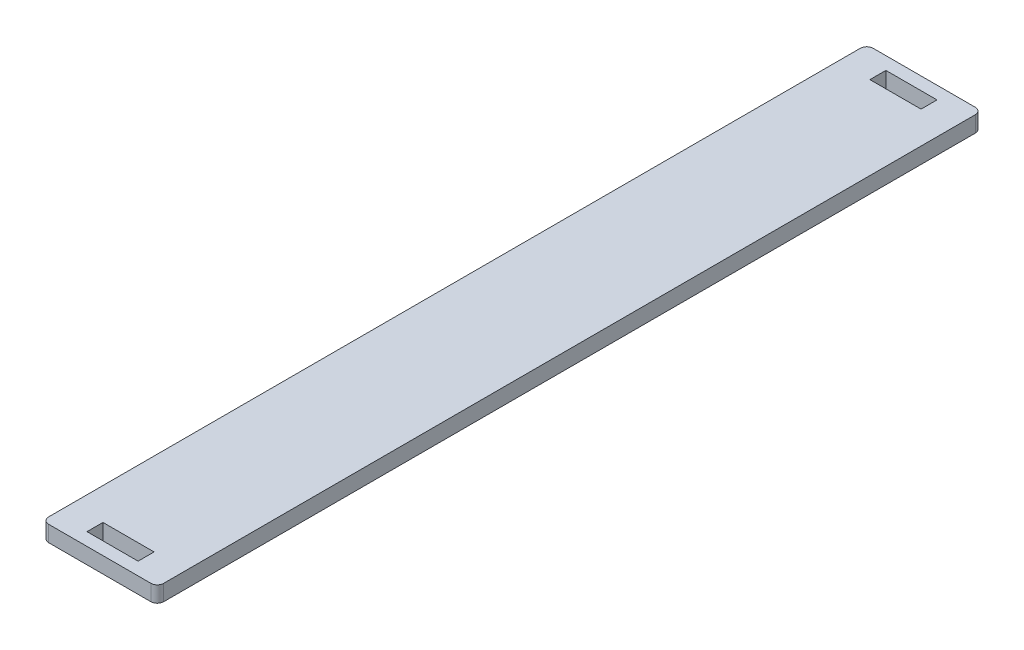
ISO-10303-21;
HEADER;
FILE_DESCRIPTION(('STEP AP214'),'2;1');
FILE_NAME('part.step','',(''),(''),'','','');
FILE_SCHEMA(('AUTOMOTIVE_DESIGN { 1 0 10303 214 1 1 1 1 }'));
ENDSEC;
DATA;
#1=APPLICATION_CONTEXT('core data for automotive mechanical design processes');
#2=APPLICATION_PROTOCOL_DEFINITION('international standard','automotive_design',2000,#1);
#3=PRODUCT_CONTEXT('',#1,'mechanical');
#4=PRODUCT('Part','Part','',(#3));
#5=PRODUCT_RELATED_PRODUCT_CATEGORY('part','',(#4));
#6=PRODUCT_DEFINITION_FORMATION('','',#4);
#7=PRODUCT_DEFINITION_CONTEXT('part definition',#1,'design');
#8=PRODUCT_DEFINITION('design','',#6,#7);
#9=PRODUCT_DEFINITION_SHAPE('','',#8);
#10=(LENGTH_UNIT() NAMED_UNIT(*) SI_UNIT(.MILLI.,.METRE.));
#11=(NAMED_UNIT(*) PLANE_ANGLE_UNIT() SI_UNIT($,.RADIAN.));
#12=(NAMED_UNIT(*) SI_UNIT($,.STERADIAN.) SOLID_ANGLE_UNIT());
#13=UNCERTAINTY_MEASURE_WITH_UNIT(LENGTH_MEASURE(1.E-05),#10,'distance_accuracy_value','');
#14=(GEOMETRIC_REPRESENTATION_CONTEXT(3) GLOBAL_UNCERTAINTY_ASSIGNED_CONTEXT((#13)) GLOBAL_UNIT_ASSIGNED_CONTEXT((#10,
#11,#12)) REPRESENTATION_CONTEXT('',''));
#15=CARTESIAN_POINT('',(0.,0.,0.));
#16=DIRECTION('',(0.,0.,1.));
#17=DIRECTION('',(1.,0.,0.));
#18=AXIS2_PLACEMENT_3D('',#15,#16,#17);
#19=CARTESIAN_POINT('',(0.,2.5,0.));
#20=DIRECTION('',(0.,-1.,0.));
#21=DIRECTION('',(0.,0.,-1.));
#22=AXIS2_PLACEMENT_3D('',#19,#20,#21);
#23=PLANE('',#22);
#24=DIRECTION('',(0.,0.,-1.));
#25=VECTOR('',#24,1.);
#26=CARTESIAN_POINT('',(4.,2.5,-60.));
#27=LINE('',#26,#25);
#28=CARTESIAN_POINT('',(4.,2.5,-60.));
#29=VERTEX_POINT('',#28);
#30=CARTESIAN_POINT('',(4.,2.5,-62.5));
#31=VERTEX_POINT('',#30);
#32=EDGE_CURVE('E188',#29,#31,#27,.T.);
#33=ORIENTED_EDGE('',*,*,#32,.F.);
#34=DIRECTION('',(1.,0.,0.));
#35=VECTOR('',#34,1.);
#36=CARTESIAN_POINT('',(-4.,2.5,-60.));
#37=LINE('',#36,#35);
#38=CARTESIAN_POINT('',(-4.,2.5,-60.));
#39=VERTEX_POINT('',#38);
#40=EDGE_CURVE('E196',#39,#29,#37,.T.);
#41=ORIENTED_EDGE('',*,*,#40,.F.);
#42=DIRECTION('',(0.,0.,1.));
#43=VECTOR('',#42,1.);
#44=CARTESIAN_POINT('',(-4.,2.5,-60.));
#45=LINE('',#44,#43);
#46=CARTESIAN_POINT('',(-4.,2.5,-62.5));
#47=VERTEX_POINT('',#46);
#48=EDGE_CURVE('E193',#47,#39,#45,.T.);
#49=ORIENTED_EDGE('',*,*,#48,.F.);
#50=DIRECTION('',(-1.,0.,0.));
#51=VECTOR('',#50,1.);
#52=CARTESIAN_POINT('',(-4.,2.5,-62.5));
#53=LINE('',#52,#51);
#54=EDGE_CURVE('E190',#31,#47,#53,.T.);
#55=ORIENTED_EDGE('',*,*,#54,.F.);
#56=EDGE_LOOP('',(#33,#41,#49,#55));
#57=FACE_BOUND('',#56,.T.);
#58=DIRECTION('',(-1.,0.,0.));
#59=VECTOR('',#58,1.);
#60=CARTESIAN_POINT('',(-9.,2.5,-64.5));
#61=LINE('',#60,#59);
#62=CARTESIAN_POINT('',(8.,2.5,-64.5));
#63=VERTEX_POINT('',#62);
#64=CARTESIAN_POINT('',(-8.,2.5,-64.5));
#65=VERTEX_POINT('',#64);
#66=EDGE_CURVE('E222',#63,#65,#61,.T.);
#67=ORIENTED_EDGE('',*,*,#66,.T.);
#68=CARTESIAN_POINT('',(-8.,2.5,-63.5));
#69=DIRECTION('',(0.,-1.,0.));
#70=DIRECTION('',(0.,0.,-1.));
#71=AXIS2_PLACEMENT_3D('',#68,#69,#70);
#72=CIRCLE('',#71,1.);
#73=CARTESIAN_POINT('',(-9.,2.5,-63.5));
#74=VERTEX_POINT('',#73);
#75=EDGE_CURVE('E262',#65,#74,#72,.F.);
#76=ORIENTED_EDGE('',*,*,#75,.T.);
#77=DIRECTION('',(0.,0.,1.));
#78=VECTOR('',#77,1.);
#79=CARTESIAN_POINT('',(-9.,2.5,64.5));
#80=LINE('',#79,#78);
#81=CARTESIAN_POINT('',(-9.,2.5,63.5));
#82=VERTEX_POINT('',#81);
#83=EDGE_CURVE('E226',#74,#82,#80,.T.);
#84=ORIENTED_EDGE('',*,*,#83,.T.);
#85=CARTESIAN_POINT('',(-8.,2.5,63.5));
#86=DIRECTION('',(0.,-1.,0.));
#87=DIRECTION('',(0.,0.,-1.));
#88=AXIS2_PLACEMENT_3D('',#85,#86,#87);
#89=CIRCLE('',#88,1.);
#90=CARTESIAN_POINT('',(-8.,2.5,64.5));
#91=VERTEX_POINT('',#90);
#92=EDGE_CURVE('E53',#82,#91,#89,.F.);
#93=ORIENTED_EDGE('',*,*,#92,.T.);
#94=DIRECTION('',(1.,0.,0.));
#95=VECTOR('',#94,1.);
#96=CARTESIAN_POINT('',(-9.,2.5,64.5));
#97=LINE('',#96,#95);
#98=CARTESIAN_POINT('',(8.,2.5,64.5));
#99=VERTEX_POINT('',#98);
#100=EDGE_CURVE('E228',#91,#99,#97,.T.);
#101=ORIENTED_EDGE('',*,*,#100,.T.);
#102=CARTESIAN_POINT('',(8.,2.5,63.5));
#103=DIRECTION('',(0.,-1.,0.));
#104=DIRECTION('',(0.,0.,-1.));
#105=AXIS2_PLACEMENT_3D('',#102,#103,#104);
#106=CIRCLE('',#105,1.);
#107=CARTESIAN_POINT('',(9.,2.5,63.5));
#108=VERTEX_POINT('',#107);
#109=EDGE_CURVE('E258',#99,#108,#106,.F.);
#110=ORIENTED_EDGE('',*,*,#109,.T.);
#111=DIRECTION('',(0.,0.,-1.));
#112=VECTOR('',#111,1.);
#113=CARTESIAN_POINT('',(9.,2.5,64.5));
#114=LINE('',#113,#112);
#115=CARTESIAN_POINT('',(9.,2.5,-63.5));
#116=VERTEX_POINT('',#115);
#117=EDGE_CURVE('E219',#108,#116,#114,.T.);
#118=ORIENTED_EDGE('',*,*,#117,.T.);
#119=CARTESIAN_POINT('',(8.,2.5,-63.5));
#120=DIRECTION('',(0.,-1.,0.));
#121=DIRECTION('',(0.,0.,-1.));
#122=AXIS2_PLACEMENT_3D('',#119,#120,#121);
#123=CIRCLE('',#122,1.);
#124=EDGE_CURVE('E260',#116,#63,#123,.F.);
#125=ORIENTED_EDGE('',*,*,#124,.T.);
#126=EDGE_LOOP('',(#67,#76,#84,#93,#101,#110,#118,#125));
#127=FACE_BOUND('',#126,.T.);
#128=DIRECTION('',(0.,0.,1.));
#129=VECTOR('',#128,1.);
#130=CARTESIAN_POINT('',(-4.,2.5,60.));
#131=LINE('',#130,#129);
#132=CARTESIAN_POINT('',(-4.,2.5,60.));
#133=VERTEX_POINT('',#132);
#134=CARTESIAN_POINT('',(-4.,2.5,62.5));
#135=VERTEX_POINT('',#134);
#136=EDGE_CURVE('E147',#133,#135,#131,.T.);
#137=ORIENTED_EDGE('',*,*,#136,.F.);
#138=DIRECTION('',(-1.,0.,0.));
#139=VECTOR('',#138,1.);
#140=CARTESIAN_POINT('',(-4.,2.5,60.));
#141=LINE('',#140,#139);
#142=CARTESIAN_POINT('',(4.,2.5,60.));
#143=VERTEX_POINT('',#142);
#144=EDGE_CURVE('E172',#143,#133,#141,.T.);
#145=ORIENTED_EDGE('',*,*,#144,.F.);
#146=DIRECTION('',(0.,0.,-1.));
#147=VECTOR('',#146,1.);
#148=CARTESIAN_POINT('',(4.,2.5,60.));
#149=LINE('',#148,#147);
#150=CARTESIAN_POINT('',(4.,2.5,62.5));
#151=VERTEX_POINT('',#150);
#152=EDGE_CURVE('E170',#151,#143,#149,.T.);
#153=ORIENTED_EDGE('',*,*,#152,.F.);
#154=DIRECTION('',(1.,0.,0.));
#155=VECTOR('',#154,1.);
#156=CARTESIAN_POINT('',(-4.,2.5,62.5));
#157=LINE('',#156,#155);
#158=EDGE_CURVE('E157',#135,#151,#157,.T.);
#159=ORIENTED_EDGE('',*,*,#158,.F.);
#160=EDGE_LOOP('',(#137,#145,#153,#159));
#161=FACE_BOUND('',#160,.T.);
#162=ADVANCED_FACE('F33',(#57,#127,#161),#23,.F.);
#163=CARTESIAN_POINT('',(0.,0.,0.));
#164=DIRECTION('',(0.,-1.,0.));
#165=DIRECTION('',(0.,0.,-1.));
#166=AXIS2_PLACEMENT_3D('',#163,#164,#165);
#167=PLANE('',#166);
#168=DIRECTION('',(0.,0.,1.));
#169=VECTOR('',#168,1.);
#170=CARTESIAN_POINT('',(-9.,0.,64.5));
#171=LINE('',#170,#169);
#172=CARTESIAN_POINT('',(-9.,0.,-63.5));
#173=VERTEX_POINT('',#172);
#174=CARTESIAN_POINT('',(-9.,0.,63.5));
#175=VERTEX_POINT('',#174);
#176=EDGE_CURVE('E236',#173,#175,#171,.T.);
#177=ORIENTED_EDGE('',*,*,#176,.F.);
#178=CARTESIAN_POINT('',(-8.,0.,-63.5));
#179=DIRECTION('',(0.,-1.,0.));
#180=DIRECTION('',(0.,0.,-1.));
#181=AXIS2_PLACEMENT_3D('',#178,#179,#180);
#182=CIRCLE('',#181,1.);
#183=CARTESIAN_POINT('',(-8.,0.,-64.5));
#184=VERTEX_POINT('',#183);
#185=EDGE_CURVE('E250',#173,#184,#182,.T.);
#186=ORIENTED_EDGE('',*,*,#185,.T.);
#187=DIRECTION('',(-1.,0.,0.));
#188=VECTOR('',#187,1.);
#189=CARTESIAN_POINT('',(-9.,0.,-64.5));
#190=LINE('',#189,#188);
#191=CARTESIAN_POINT('',(8.,0.,-64.5));
#192=VERTEX_POINT('',#191);
#193=EDGE_CURVE('E233',#192,#184,#190,.T.);
#194=ORIENTED_EDGE('',*,*,#193,.F.);
#195=CARTESIAN_POINT('',(8.,0.,-63.5));
#196=DIRECTION('',(0.,-1.,0.));
#197=DIRECTION('',(0.,0.,-1.));
#198=AXIS2_PLACEMENT_3D('',#195,#196,#197);
#199=CIRCLE('',#198,1.);
#200=CARTESIAN_POINT('',(9.,0.,-63.5));
#201=VERTEX_POINT('',#200);
#202=EDGE_CURVE('E248',#192,#201,#199,.T.);
#203=ORIENTED_EDGE('',*,*,#202,.T.);
#204=DIRECTION('',(0.,0.,-1.));
#205=VECTOR('',#204,1.);
#206=CARTESIAN_POINT('',(9.,0.,64.5));
#207=LINE('',#206,#205);
#208=CARTESIAN_POINT('',(9.,0.,63.5));
#209=VERTEX_POINT('',#208);
#210=EDGE_CURVE('E218',#209,#201,#207,.T.);
#211=ORIENTED_EDGE('',*,*,#210,.F.);
#212=CARTESIAN_POINT('',(8.,0.,63.5));
#213=DIRECTION('',(0.,-1.,0.));
#214=DIRECTION('',(0.,0.,-1.));
#215=AXIS2_PLACEMENT_3D('',#212,#213,#214);
#216=CIRCLE('',#215,1.);
#217=CARTESIAN_POINT('',(8.,0.,64.5));
#218=VERTEX_POINT('',#217);
#219=EDGE_CURVE('E246',#209,#218,#216,.T.);
#220=ORIENTED_EDGE('',*,*,#219,.T.);
#221=DIRECTION('',(1.,0.,0.));
#222=VECTOR('',#221,1.);
#223=CARTESIAN_POINT('',(-9.,0.,64.5));
#224=LINE('',#223,#222);
#225=CARTESIAN_POINT('',(-8.,0.,64.5));
#226=VERTEX_POINT('',#225);
#227=EDGE_CURVE('E223',#226,#218,#224,.T.);
#228=ORIENTED_EDGE('',*,*,#227,.F.);
#229=CARTESIAN_POINT('',(-8.,0.,63.5));
#230=DIRECTION('',(0.,-1.,0.));
#231=DIRECTION('',(0.,0.,-1.));
#232=AXIS2_PLACEMENT_3D('',#229,#230,#231);
#233=CIRCLE('',#232,1.);
#234=EDGE_CURVE('E244',#226,#175,#233,.T.);
#235=ORIENTED_EDGE('',*,*,#234,.T.);
#236=EDGE_LOOP('',(#177,#186,#194,#203,#211,#220,#228,#235));
#237=FACE_BOUND('',#236,.T.);
#238=DIRECTION('',(1.,0.,0.));
#239=VECTOR('',#238,1.);
#240=CARTESIAN_POINT('',(-4.,0.,-60.));
#241=LINE('',#240,#239);
#242=CARTESIAN_POINT('',(-4.,0.,-60.));
#243=VERTEX_POINT('',#242);
#244=CARTESIAN_POINT('',(4.,0.,-60.));
#245=VERTEX_POINT('',#244);
#246=EDGE_CURVE('E191',#243,#245,#241,.T.);
#247=ORIENTED_EDGE('',*,*,#246,.T.);
#248=DIRECTION('',(0.,0.,-1.));
#249=VECTOR('',#248,1.);
#250=CARTESIAN_POINT('',(4.,0.,-60.));
#251=LINE('',#250,#249);
#252=CARTESIAN_POINT('',(4.,0.,-62.5));
#253=VERTEX_POINT('',#252);
#254=EDGE_CURVE('E165',#245,#253,#251,.T.);
#255=ORIENTED_EDGE('',*,*,#254,.T.);
#256=DIRECTION('',(-1.,0.,0.));
#257=VECTOR('',#256,1.);
#258=CARTESIAN_POINT('',(-4.,0.,-62.5));
#259=LINE('',#258,#257);
#260=CARTESIAN_POINT('',(-4.,0.,-62.5));
#261=VERTEX_POINT('',#260);
#262=EDGE_CURVE('E201',#253,#261,#259,.T.);
#263=ORIENTED_EDGE('',*,*,#262,.T.);
#264=DIRECTION('',(0.,0.,1.));
#265=VECTOR('',#264,1.);
#266=CARTESIAN_POINT('',(-4.,0.,-60.));
#267=LINE('',#266,#265);
#268=EDGE_CURVE('E204',#261,#243,#267,.T.);
#269=ORIENTED_EDGE('',*,*,#268,.T.);
#270=EDGE_LOOP('',(#247,#255,#263,#269));
#271=FACE_BOUND('',#270,.T.);
#272=DIRECTION('',(-1.,0.,0.));
#273=VECTOR('',#272,1.);
#274=CARTESIAN_POINT('',(-4.,0.,60.));
#275=LINE('',#274,#273);
#276=CARTESIAN_POINT('',(4.,0.,60.));
#277=VERTEX_POINT('',#276);
#278=CARTESIAN_POINT('',(-4.,0.,60.));
#279=VERTEX_POINT('',#278);
#280=EDGE_CURVE('E158',#277,#279,#275,.T.);
#281=ORIENTED_EDGE('',*,*,#280,.T.);
#282=DIRECTION('',(0.,0.,1.));
#283=VECTOR('',#282,1.);
#284=CARTESIAN_POINT('',(-4.,0.,60.));
#285=LINE('',#284,#283);
#286=CARTESIAN_POINT('',(-4.,0.,62.5));
#287=VERTEX_POINT('',#286);
#288=EDGE_CURVE('E176',#279,#287,#285,.T.);
#289=ORIENTED_EDGE('',*,*,#288,.T.);
#290=DIRECTION('',(1.,0.,0.));
#291=VECTOR('',#290,1.);
#292=CARTESIAN_POINT('',(-4.,0.,62.5));
#293=LINE('',#292,#291);
#294=CARTESIAN_POINT('',(4.,0.,62.5));
#295=VERTEX_POINT('',#294);
#296=EDGE_CURVE('E164',#287,#295,#293,.T.);
#297=ORIENTED_EDGE('',*,*,#296,.T.);
#298=DIRECTION('',(0.,0.,-1.));
#299=VECTOR('',#298,1.);
#300=CARTESIAN_POINT('',(4.,0.,60.));
#301=LINE('',#300,#299);
#302=EDGE_CURVE('E179',#295,#277,#301,.T.);
#303=ORIENTED_EDGE('',*,*,#302,.T.);
#304=EDGE_LOOP('',(#281,#289,#297,#303));
#305=FACE_BOUND('',#304,.T.);
#306=ADVANCED_FACE('F275',(#237,#271,#305),#167,.T.);
#307=CARTESIAN_POINT('',(9.,2.5,64.5));
#308=DIRECTION('',(-1.,0.,0.));
#309=DIRECTION('',(0.,0.,1.));
#310=AXIS2_PLACEMENT_3D('',#307,#308,#309);
#311=PLANE('',#310);
#312=ORIENTED_EDGE('',*,*,#210,.T.);
#313=DIRECTION('',(0.,-1.,0.));
#314=VECTOR('',#313,1.);
#315=CARTESIAN_POINT('',(9.,2.5,-63.5));
#316=LINE('',#315,#314);
#317=EDGE_CURVE('E267',#201,#116,#316,.F.);
#318=ORIENTED_EDGE('',*,*,#317,.T.);
#319=ORIENTED_EDGE('',*,*,#117,.F.);
#320=DIRECTION('',(0.,-1.,0.));
#321=VECTOR('',#320,1.);
#322=CARTESIAN_POINT('',(9.,2.5,63.5));
#323=LINE('',#322,#321);
#324=EDGE_CURVE('E264',#108,#209,#323,.T.);
#325=ORIENTED_EDGE('',*,*,#324,.T.);
#326=EDGE_LOOP('',(#312,#318,#319,#325));
#327=FACE_BOUND('',#326,.T.);
#328=ADVANCED_FACE('F284',(#327),#311,.F.);
#329=CARTESIAN_POINT('',(-9.,2.5,-64.5));
#330=DIRECTION('',(0.,0.,1.));
#331=DIRECTION('',(1.,0.,0.));
#332=AXIS2_PLACEMENT_3D('',#329,#330,#331);
#333=PLANE('',#332);
#334=ORIENTED_EDGE('',*,*,#193,.T.);
#335=DIRECTION('',(0.,-1.,0.));
#336=VECTOR('',#335,1.);
#337=CARTESIAN_POINT('',(-8.,2.5,-64.5));
#338=LINE('',#337,#336);
#339=EDGE_CURVE('E255',#184,#65,#338,.F.);
#340=ORIENTED_EDGE('',*,*,#339,.T.);
#341=ORIENTED_EDGE('',*,*,#66,.F.);
#342=DIRECTION('',(0.,-1.,0.));
#343=VECTOR('',#342,1.);
#344=CARTESIAN_POINT('',(8.,2.5,-64.5));
#345=LINE('',#344,#343);
#346=EDGE_CURVE('E252',#63,#192,#345,.T.);
#347=ORIENTED_EDGE('',*,*,#346,.T.);
#348=EDGE_LOOP('',(#334,#340,#341,#347));
#349=FACE_BOUND('',#348,.T.);
#350=ADVANCED_FACE('F293',(#349),#333,.F.);
#351=CARTESIAN_POINT('',(-9.,2.5,64.5));
#352=DIRECTION('',(1.,0.,0.));
#353=DIRECTION('',(0.,0.,-1.));
#354=AXIS2_PLACEMENT_3D('',#351,#352,#353);
#355=PLANE('',#354);
#356=ORIENTED_EDGE('',*,*,#83,.F.);
#357=DIRECTION('',(0.,-1.,0.));
#358=VECTOR('',#357,1.);
#359=CARTESIAN_POINT('',(-9.,2.5,-63.5));
#360=LINE('',#359,#358);
#361=EDGE_CURVE('E241',#74,#173,#360,.T.);
#362=ORIENTED_EDGE('',*,*,#361,.T.);
#363=ORIENTED_EDGE('',*,*,#176,.T.);
#364=DIRECTION('',(0.,-1.,0.));
#365=VECTOR('',#364,1.);
#366=CARTESIAN_POINT('',(-9.,2.5,63.5));
#367=LINE('',#366,#365);
#368=EDGE_CURVE('E230',#175,#82,#367,.F.);
#369=ORIENTED_EDGE('',*,*,#368,.T.);
#370=EDGE_LOOP('',(#356,#362,#363,#369));
#371=FACE_BOUND('',#370,.T.);
#372=ADVANCED_FACE('F301',(#371),#355,.F.);
#373=CARTESIAN_POINT('',(-9.,2.5,64.5));
#374=DIRECTION('',(0.,0.,-1.));
#375=DIRECTION('',(-1.,0.,0.));
#376=AXIS2_PLACEMENT_3D('',#373,#374,#375);
#377=PLANE('',#376);
#378=ORIENTED_EDGE('',*,*,#227,.T.);
#379=DIRECTION('',(0.,-1.,0.));
#380=VECTOR('',#379,1.);
#381=CARTESIAN_POINT('',(8.,2.5,64.5));
#382=LINE('',#381,#380);
#383=EDGE_CURVE('E11',#218,#99,#382,.F.);
#384=ORIENTED_EDGE('',*,*,#383,.T.);
#385=ORIENTED_EDGE('',*,*,#100,.F.);
#386=DIRECTION('',(0.,-1.,0.));
#387=VECTOR('',#386,1.);
#388=CARTESIAN_POINT('',(-8.,2.5,64.5));
#389=LINE('',#388,#387);
#390=EDGE_CURVE('E41',#91,#226,#389,.T.);
#391=ORIENTED_EDGE('',*,*,#390,.T.);
#392=EDGE_LOOP('',(#378,#384,#385,#391));
#393=FACE_BOUND('',#392,.T.);
#394=ADVANCED_FACE('F271',(#393),#377,.F.);
#395=CARTESIAN_POINT('',(4.,2.5,-60.));
#396=DIRECTION('',(-1.,0.,0.));
#397=DIRECTION('',(0.,0.,1.));
#398=AXIS2_PLACEMENT_3D('',#395,#396,#397);
#399=PLANE('',#398);
#400=ORIENTED_EDGE('',*,*,#254,.F.);
#401=DIRECTION('',(0.,-1.,0.));
#402=VECTOR('',#401,1.);
#403=CARTESIAN_POINT('',(4.,2.5,-60.));
#404=LINE('',#403,#402);
#405=EDGE_CURVE('E198',#29,#245,#404,.T.);
#406=ORIENTED_EDGE('',*,*,#405,.F.);
#407=ORIENTED_EDGE('',*,*,#32,.T.);
#408=DIRECTION('',(0.,-1.,0.));
#409=VECTOR('',#408,1.);
#410=CARTESIAN_POINT('',(4.,2.5,-62.5));
#411=LINE('',#410,#409);
#412=EDGE_CURVE('E215',#31,#253,#411,.T.);
#413=ORIENTED_EDGE('',*,*,#412,.T.);
#414=EDGE_LOOP('',(#400,#406,#407,#413));
#415=FACE_BOUND('',#414,.T.);
#416=ADVANCED_FACE('F316',(#415),#399,.T.);
#417=CARTESIAN_POINT('',(-4.,2.5,-62.5));
#418=DIRECTION('',(0.,0.,1.));
#419=DIRECTION('',(1.,0.,0.));
#420=AXIS2_PLACEMENT_3D('',#417,#418,#419);
#421=PLANE('',#420);
#422=ORIENTED_EDGE('',*,*,#262,.F.);
#423=ORIENTED_EDGE('',*,*,#412,.F.);
#424=ORIENTED_EDGE('',*,*,#54,.T.);
#425=DIRECTION('',(0.,-1.,0.));
#426=VECTOR('',#425,1.);
#427=CARTESIAN_POINT('',(-4.,2.5,-62.5));
#428=LINE('',#427,#426);
#429=EDGE_CURVE('E213',#47,#261,#428,.T.);
#430=ORIENTED_EDGE('',*,*,#429,.T.);
#431=EDGE_LOOP('',(#422,#423,#424,#430));
#432=FACE_BOUND('',#431,.T.);
#433=ADVANCED_FACE('F401',(#432),#421,.T.);
#434=CARTESIAN_POINT('',(-4.,2.5,-60.));
#435=DIRECTION('',(1.,0.,0.));
#436=DIRECTION('',(0.,0.,-1.));
#437=AXIS2_PLACEMENT_3D('',#434,#435,#436);
#438=PLANE('',#437);
#439=ORIENTED_EDGE('',*,*,#268,.F.);
#440=ORIENTED_EDGE('',*,*,#429,.F.);
#441=ORIENTED_EDGE('',*,*,#48,.T.);
#442=DIRECTION('',(0.,-1.,0.));
#443=VECTOR('',#442,1.);
#444=CARTESIAN_POINT('',(-4.,2.5,-60.));
#445=LINE('',#444,#443);
#446=EDGE_CURVE('E211',#39,#243,#445,.T.);
#447=ORIENTED_EDGE('',*,*,#446,.T.);
#448=EDGE_LOOP('',(#439,#440,#441,#447));
#449=FACE_BOUND('',#448,.T.);
#450=ADVANCED_FACE('F392',(#449),#438,.T.);
#451=CARTESIAN_POINT('',(-4.,2.5,-60.));
#452=DIRECTION('',(0.,0.,-1.));
#453=DIRECTION('',(-1.,0.,0.));
#454=AXIS2_PLACEMENT_3D('',#451,#452,#453);
#455=PLANE('',#454);
#456=ORIENTED_EDGE('',*,*,#246,.F.);
#457=ORIENTED_EDGE('',*,*,#446,.F.);
#458=ORIENTED_EDGE('',*,*,#40,.T.);
#459=ORIENTED_EDGE('',*,*,#405,.T.);
#460=EDGE_LOOP('',(#456,#457,#458,#459));
#461=FACE_BOUND('',#460,.T.);
#462=ADVANCED_FACE('F384',(#461),#455,.T.);
#463=CARTESIAN_POINT('',(-4.,2.5,60.));
#464=DIRECTION('',(1.,0.,0.));
#465=DIRECTION('',(0.,0.,-1.));
#466=AXIS2_PLACEMENT_3D('',#463,#464,#465);
#467=PLANE('',#466);
#468=ORIENTED_EDGE('',*,*,#288,.F.);
#469=DIRECTION('',(0.,-1.,0.));
#470=VECTOR('',#469,1.);
#471=CARTESIAN_POINT('',(-4.,2.5,60.));
#472=LINE('',#471,#470);
#473=EDGE_CURVE('E153',#133,#279,#472,.T.);
#474=ORIENTED_EDGE('',*,*,#473,.F.);
#475=ORIENTED_EDGE('',*,*,#136,.T.);
#476=DIRECTION('',(0.,-1.,0.));
#477=VECTOR('',#476,1.);
#478=CARTESIAN_POINT('',(-4.,2.5,62.5));
#479=LINE('',#478,#477);
#480=EDGE_CURVE('E150',#135,#287,#479,.T.);
#481=ORIENTED_EDGE('',*,*,#480,.T.);
#482=EDGE_LOOP('',(#468,#474,#475,#481));
#483=FACE_BOUND('',#482,.T.);
#484=ADVANCED_FACE('F149',(#483),#467,.T.);
#485=CARTESIAN_POINT('',(-4.,2.5,62.5));
#486=DIRECTION('',(0.,0.,-1.));
#487=DIRECTION('',(-1.,0.,0.));
#488=AXIS2_PLACEMENT_3D('',#485,#486,#487);
#489=PLANE('',#488);
#490=ORIENTED_EDGE('',*,*,#296,.F.);
#491=ORIENTED_EDGE('',*,*,#480,.F.);
#492=ORIENTED_EDGE('',*,*,#158,.T.);
#493=DIRECTION('',(0.,-1.,0.));
#494=VECTOR('',#493,1.);
#495=CARTESIAN_POINT('',(4.,2.5,62.5));
#496=LINE('',#495,#494);
#497=EDGE_CURVE('E166',#151,#295,#496,.T.);
#498=ORIENTED_EDGE('',*,*,#497,.T.);
#499=EDGE_LOOP('',(#490,#491,#492,#498));
#500=FACE_BOUND('',#499,.T.);
#501=ADVANCED_FACE('F161',(#500),#489,.T.);
#502=CARTESIAN_POINT('',(4.,2.5,60.));
#503=DIRECTION('',(-1.,0.,0.));
#504=DIRECTION('',(0.,0.,1.));
#505=AXIS2_PLACEMENT_3D('',#502,#503,#504);
#506=PLANE('',#505);
#507=ORIENTED_EDGE('',*,*,#302,.F.);
#508=ORIENTED_EDGE('',*,*,#497,.F.);
#509=ORIENTED_EDGE('',*,*,#152,.T.);
#510=DIRECTION('',(0.,-1.,0.));
#511=VECTOR('',#510,1.);
#512=CARTESIAN_POINT('',(4.,2.5,60.));
#513=LINE('',#512,#511);
#514=EDGE_CURVE('E185',#143,#277,#513,.T.);
#515=ORIENTED_EDGE('',*,*,#514,.T.);
#516=EDGE_LOOP('',(#507,#508,#509,#515));
#517=FACE_BOUND('',#516,.T.);
#518=ADVANCED_FACE('F360',(#517),#506,.T.);
#519=CARTESIAN_POINT('',(-4.,2.5,60.));
#520=DIRECTION('',(0.,0.,1.));
#521=DIRECTION('',(1.,0.,0.));
#522=AXIS2_PLACEMENT_3D('',#519,#520,#521);
#523=PLANE('',#522);
#524=ORIENTED_EDGE('',*,*,#280,.F.);
#525=ORIENTED_EDGE('',*,*,#514,.F.);
#526=ORIENTED_EDGE('',*,*,#144,.T.);
#527=ORIENTED_EDGE('',*,*,#473,.T.);
#528=EDGE_LOOP('',(#524,#525,#526,#527));
#529=FACE_BOUND('',#528,.T.);
#530=ADVANCED_FACE('F329',(#529),#523,.T.);
#531=CARTESIAN_POINT('',(-8.,2.5,-63.5));
#532=DIRECTION('',(0.,-1.,0.));
#533=DIRECTION('',(0.,0.,-1.));
#534=AXIS2_PLACEMENT_3D('',#531,#532,#533);
#535=CYLINDRICAL_SURFACE('',#534,1.);
#536=ORIENTED_EDGE('',*,*,#75,.F.);
#537=ORIENTED_EDGE('',*,*,#339,.F.);
#538=ORIENTED_EDGE('',*,*,#185,.F.);
#539=ORIENTED_EDGE('',*,*,#361,.F.);
#540=EDGE_LOOP('',(#536,#537,#538,#539));
#541=FACE_BOUND('',#540,.T.);
#542=ADVANCED_FACE('F298',(#541),#535,.T.);
#543=CARTESIAN_POINT('',(8.,2.5,-63.5));
#544=DIRECTION('',(0.,-1.,0.));
#545=DIRECTION('',(0.,0.,-1.));
#546=AXIS2_PLACEMENT_3D('',#543,#544,#545);
#547=CYLINDRICAL_SURFACE('',#546,1.);
#548=ORIENTED_EDGE('',*,*,#124,.F.);
#549=ORIENTED_EDGE('',*,*,#317,.F.);
#550=ORIENTED_EDGE('',*,*,#202,.F.);
#551=ORIENTED_EDGE('',*,*,#346,.F.);
#552=EDGE_LOOP('',(#548,#549,#550,#551));
#553=FACE_BOUND('',#552,.T.);
#554=ADVANCED_FACE('F290',(#553),#547,.T.);
#555=CARTESIAN_POINT('',(8.,2.5,63.5));
#556=DIRECTION('',(0.,-1.,0.));
#557=DIRECTION('',(0.,0.,-1.));
#558=AXIS2_PLACEMENT_3D('',#555,#556,#557);
#559=CYLINDRICAL_SURFACE('',#558,1.);
#560=ORIENTED_EDGE('',*,*,#109,.F.);
#561=ORIENTED_EDGE('',*,*,#383,.F.);
#562=ORIENTED_EDGE('',*,*,#219,.F.);
#563=ORIENTED_EDGE('',*,*,#324,.F.);
#564=EDGE_LOOP('',(#560,#561,#562,#563));
#565=FACE_BOUND('',#564,.T.);
#566=ADVANCED_FACE('F281',(#565),#559,.T.);
#567=CARTESIAN_POINT('',(-8.,2.5,63.5));
#568=DIRECTION('',(0.,-1.,0.));
#569=DIRECTION('',(0.,0.,-1.));
#570=AXIS2_PLACEMENT_3D('',#567,#568,#569);
#571=CYLINDRICAL_SURFACE('',#570,1.);
#572=ORIENTED_EDGE('',*,*,#92,.F.);
#573=ORIENTED_EDGE('',*,*,#368,.F.);
#574=ORIENTED_EDGE('',*,*,#234,.F.);
#575=ORIENTED_EDGE('',*,*,#390,.F.);
#576=EDGE_LOOP('',(#572,#573,#574,#575));
#577=FACE_BOUND('',#576,.T.);
#578=ADVANCED_FACE('F35',(#577),#571,.T.);
#579=CLOSED_SHELL('',(#162,#306,#328,#350,#372,#394,#416,#433,#450,#462,#484,#501,#518,#530,
#542,#554,#566,#578));
#580=MANIFOLD_SOLID_BREP('B2',#579);
#581=ADVANCED_BREP_SHAPE_REPRESENTATION('',(#18,#580),#14);
#582=SHAPE_DEFINITION_REPRESENTATION(#9,#581);
ENDSEC;
END-ISO-10303-21;
